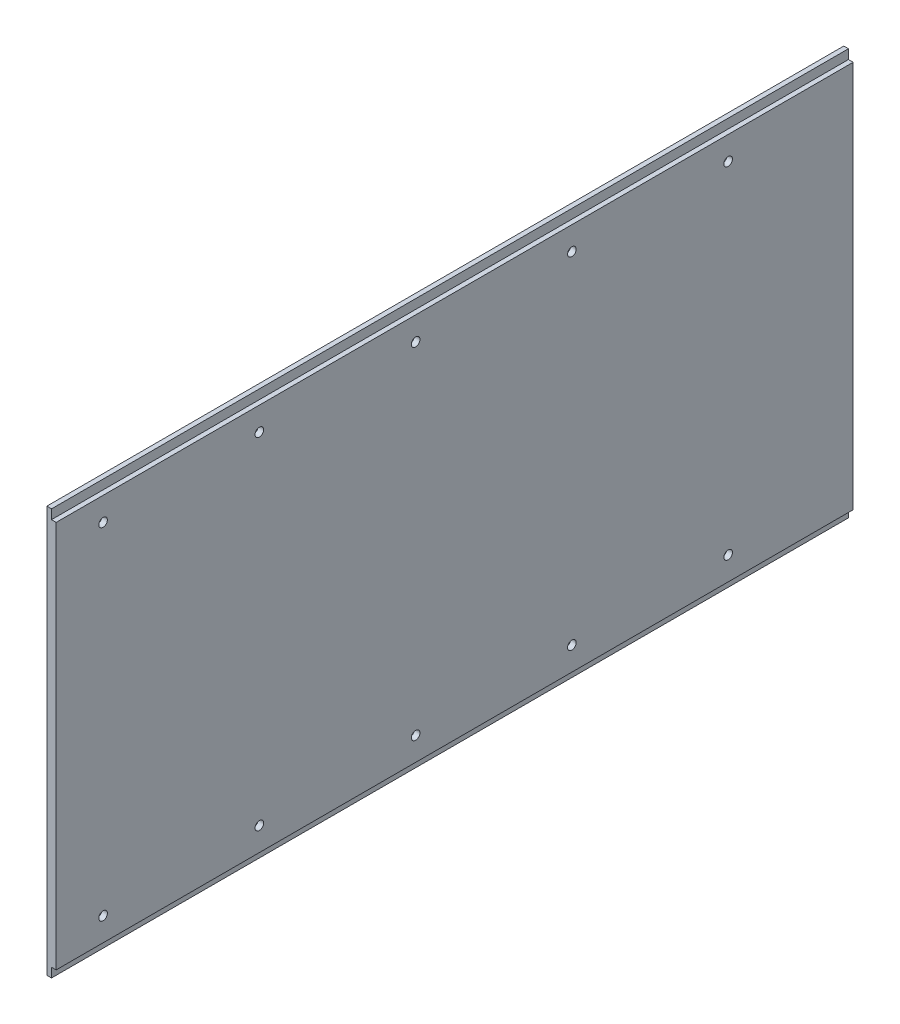
ISO-10303-21;
HEADER;
FILE_DESCRIPTION(('STEP AP214'),'2;1');
FILE_NAME('part.step','',(''),(''),'','','');
FILE_SCHEMA(('AUTOMOTIVE_DESIGN { 1 0 10303 214 1 1 1 1 }'));
ENDSEC;
DATA;
#1=APPLICATION_CONTEXT('core data for automotive mechanical design processes');
#2=APPLICATION_PROTOCOL_DEFINITION('international standard','automotive_design',2000,#1);
#3=PRODUCT_CONTEXT('',#1,'mechanical');
#4=PRODUCT('Part','Part','',(#3));
#5=PRODUCT_RELATED_PRODUCT_CATEGORY('part','',(#4));
#6=PRODUCT_DEFINITION_FORMATION('','',#4);
#7=PRODUCT_DEFINITION_CONTEXT('part definition',#1,'design');
#8=PRODUCT_DEFINITION('design','',#6,#7);
#9=PRODUCT_DEFINITION_SHAPE('','',#8);
#10=(LENGTH_UNIT() NAMED_UNIT(*) SI_UNIT(.MILLI.,.METRE.));
#11=(NAMED_UNIT(*) PLANE_ANGLE_UNIT() SI_UNIT($,.RADIAN.));
#12=(NAMED_UNIT(*) SI_UNIT($,.STERADIAN.) SOLID_ANGLE_UNIT());
#13=UNCERTAINTY_MEASURE_WITH_UNIT(LENGTH_MEASURE(1.E-05),#10,'distance_accuracy_value','');
#14=(GEOMETRIC_REPRESENTATION_CONTEXT(3) GLOBAL_UNCERTAINTY_ASSIGNED_CONTEXT((#13)) GLOBAL_UNIT_ASSIGNED_CONTEXT((#10,
#11,#12)) REPRESENTATION_CONTEXT('',''));
#15=CARTESIAN_POINT('',(0.,0.,0.));
#16=DIRECTION('',(0.,0.,1.));
#17=DIRECTION('',(1.,0.,0.));
#18=AXIS2_PLACEMENT_3D('',#15,#16,#17);
#19=CARTESIAN_POINT('',(6.,-130.,255.));
#20=DIRECTION('',(0.,0.,-1.));
#21=DIRECTION('',(-1.,0.,0.));
#22=AXIS2_PLACEMENT_3D('',#19,#20,#21);
#23=PLANE('',#22);
#24=DIRECTION('',(0.,-1.,0.));
#25=VECTOR('',#24,1.);
#26=CARTESIAN_POINT('',(6.,-130.,255.));
#27=LINE('',#26,#25);
#28=CARTESIAN_POINT('',(6.,124.,255.));
#29=VERTEX_POINT('',#28);
#30=CARTESIAN_POINT('',(6.,-124.,255.));
#31=VERTEX_POINT('',#30);
#32=EDGE_CURVE('E480',#29,#31,#27,.T.);
#33=ORIENTED_EDGE('',*,*,#32,.F.);
#34=DIRECTION('',(1.,0.,0.));
#35=VECTOR('',#34,1.);
#36=CARTESIAN_POINT('',(5.99999999999997,124.,255.));
#37=LINE('',#36,#35);
#38=CARTESIAN_POINT('',(2.99999999999997,124.,255.));
#39=VERTEX_POINT('',#38);
#40=EDGE_CURVE('E49',#39,#29,#37,.T.);
#41=ORIENTED_EDGE('',*,*,#40,.F.);
#42=DIRECTION('',(0.,-1.,0.));
#43=VECTOR('',#42,1.);
#44=CARTESIAN_POINT('',(2.99999999999997,130.,255.));
#45=LINE('',#44,#43);
#46=CARTESIAN_POINT('',(2.99999999999997,130.,255.));
#47=VERTEX_POINT('',#46);
#48=EDGE_CURVE('E493',#47,#39,#45,.T.);
#49=ORIENTED_EDGE('',*,*,#48,.F.);
#50=DIRECTION('',(-1.,0.,0.));
#51=VECTOR('',#50,1.);
#52=CARTESIAN_POINT('',(6.,130.,255.));
#53=LINE('',#52,#51);
#54=CARTESIAN_POINT('',(0.,130.,255.));
#55=VERTEX_POINT('',#54);
#56=EDGE_CURVE('E118',#47,#55,#53,.T.);
#57=ORIENTED_EDGE('',*,*,#56,.T.);
#58=DIRECTION('',(0.,-1.,0.));
#59=VECTOR('',#58,1.);
#60=CARTESIAN_POINT('',(0.,-130.,255.));
#61=LINE('',#60,#59);
#62=CARTESIAN_POINT('',(0.,-130.,255.));
#63=VERTEX_POINT('',#62);
#64=EDGE_CURVE('E477',#55,#63,#61,.T.);
#65=ORIENTED_EDGE('',*,*,#64,.T.);
#66=DIRECTION('',(-1.,0.,0.));
#67=VECTOR('',#66,1.);
#68=CARTESIAN_POINT('',(6.,-130.,255.));
#69=LINE('',#68,#67);
#70=CARTESIAN_POINT('',(3.,-130.,255.));
#71=VERTEX_POINT('',#70);
#72=EDGE_CURVE('E126',#71,#63,#69,.T.);
#73=ORIENTED_EDGE('',*,*,#72,.F.);
#74=DIRECTION('',(0.,-1.,0.));
#75=VECTOR('',#74,1.);
#76=CARTESIAN_POINT('',(3.,-130.,255.));
#77=LINE('',#76,#75);
#78=CARTESIAN_POINT('',(3.,-124.,255.));
#79=VERTEX_POINT('',#78);
#80=EDGE_CURVE('E464',#79,#71,#77,.T.);
#81=ORIENTED_EDGE('',*,*,#80,.F.);
#82=DIRECTION('',(-1.,0.,0.));
#83=VECTOR('',#82,1.);
#84=CARTESIAN_POINT('',(6.,-124.,255.));
#85=LINE('',#84,#83);
#86=EDGE_CURVE('E459',#31,#79,#85,.T.);
#87=ORIENTED_EDGE('',*,*,#86,.F.);
#88=EDGE_LOOP('',(#33,#41,#49,#57,#65,#73,#81,#87));
#89=FACE_BOUND('',#88,.T.);
#90=ADVANCED_FACE('F34',(#89),#23,.F.);
#91=CARTESIAN_POINT('',(6.,-130.,-255.));
#92=DIRECTION('',(0.,1.,0.));
#93=DIRECTION('',(0.,0.,1.));
#94=AXIS2_PLACEMENT_3D('',#91,#92,#93);
#95=PLANE('',#94);
#96=DIRECTION('',(-1.,0.,0.));
#97=VECTOR('',#96,1.);
#98=CARTESIAN_POINT('',(6.,-130.,-255.));
#99=LINE('',#98,#97);
#100=CARTESIAN_POINT('',(3.,-130.,-255.));
#101=VERTEX_POINT('',#100);
#102=CARTESIAN_POINT('',(0.,-130.,-255.));
#103=VERTEX_POINT('',#102);
#104=EDGE_CURVE('E124',#101,#103,#99,.T.);
#105=ORIENTED_EDGE('',*,*,#104,.F.);
#106=DIRECTION('',(0.,0.,1.));
#107=VECTOR('',#106,1.);
#108=CARTESIAN_POINT('',(3.,-130.,-255.));
#109=LINE('',#108,#107);
#110=EDGE_CURVE('E475',#101,#71,#109,.T.);
#111=ORIENTED_EDGE('',*,*,#110,.T.);
#112=ORIENTED_EDGE('',*,*,#72,.T.);
#113=DIRECTION('',(0.,0.,-1.));
#114=VECTOR('',#113,1.);
#115=CARTESIAN_POINT('',(0.,-130.,-255.));
#116=LINE('',#115,#114);
#117=EDGE_CURVE('E486',#63,#103,#116,.T.);
#118=ORIENTED_EDGE('',*,*,#117,.T.);
#119=EDGE_LOOP('',(#105,#111,#112,#118));
#120=FACE_BOUND('',#119,.T.);
#121=ADVANCED_FACE('F187',(#120),#95,.F.);
#122=CARTESIAN_POINT('',(6.,130.,-255.));
#123=DIRECTION('',(0.,0.,1.));
#124=DIRECTION('',(1.,0.,0.));
#125=AXIS2_PLACEMENT_3D('',#122,#123,#124);
#126=PLANE('',#125);
#127=DIRECTION('',(0.,-1.,0.));
#128=VECTOR('',#127,1.);
#129=CARTESIAN_POINT('',(2.99999999999997,130.,-255.));
#130=LINE('',#129,#128);
#131=CARTESIAN_POINT('',(2.99999999999997,130.,-255.));
#132=VERTEX_POINT('',#131);
#133=CARTESIAN_POINT('',(2.99999999999997,124.,-255.));
#134=VERTEX_POINT('',#133);
#135=EDGE_CURVE('E99',#132,#134,#130,.T.);
#136=ORIENTED_EDGE('',*,*,#135,.T.);
#137=DIRECTION('',(1.,0.,0.));
#138=VECTOR('',#137,1.);
#139=CARTESIAN_POINT('',(5.99999999999997,124.,-255.));
#140=LINE('',#139,#138);
#141=CARTESIAN_POINT('',(5.99999999999997,124.,-255.));
#142=VERTEX_POINT('',#141);
#143=EDGE_CURVE('E110',#134,#142,#140,.T.);
#144=ORIENTED_EDGE('',*,*,#143,.T.);
#145=DIRECTION('',(0.,1.,0.));
#146=VECTOR('',#145,1.);
#147=CARTESIAN_POINT('',(6.,130.,-255.));
#148=LINE('',#147,#146);
#149=CARTESIAN_POINT('',(6.,-124.,-255.));
#150=VERTEX_POINT('',#149);
#151=EDGE_CURVE('E128',#150,#142,#148,.T.);
#152=ORIENTED_EDGE('',*,*,#151,.F.);
#153=DIRECTION('',(-1.,0.,0.));
#154=VECTOR('',#153,1.);
#155=CARTESIAN_POINT('',(6.,-124.,-255.));
#156=LINE('',#155,#154);
#157=CARTESIAN_POINT('',(3.,-124.,-255.));
#158=VERTEX_POINT('',#157);
#159=EDGE_CURVE('E57',#150,#158,#156,.T.);
#160=ORIENTED_EDGE('',*,*,#159,.T.);
#161=DIRECTION('',(0.,-1.,0.));
#162=VECTOR('',#161,1.);
#163=CARTESIAN_POINT('',(3.,-130.,-255.));
#164=LINE('',#163,#162);
#165=EDGE_CURVE('E471',#158,#101,#164,.T.);
#166=ORIENTED_EDGE('',*,*,#165,.T.);
#167=ORIENTED_EDGE('',*,*,#104,.T.);
#168=DIRECTION('',(0.,1.,0.));
#169=VECTOR('',#168,1.);
#170=CARTESIAN_POINT('',(0.,130.,-255.));
#171=LINE('',#170,#169);
#172=CARTESIAN_POINT('',(0.,130.,-255.));
#173=VERTEX_POINT('',#172);
#174=EDGE_CURVE('E122',#103,#173,#171,.T.);
#175=ORIENTED_EDGE('',*,*,#174,.T.);
#176=DIRECTION('',(-1.,0.,0.));
#177=VECTOR('',#176,1.);
#178=CARTESIAN_POINT('',(6.,130.,-255.));
#179=LINE('',#178,#177);
#180=EDGE_CURVE('E116',#132,#173,#179,.T.);
#181=ORIENTED_EDGE('',*,*,#180,.F.);
#182=EDGE_LOOP('',(#136,#144,#152,#160,#166,#167,#175,#181));
#183=FACE_BOUND('',#182,.T.);
#184=ADVANCED_FACE('F120',(#183),#126,.F.);
#185=CARTESIAN_POINT('',(6.,130.,255.));
#186=DIRECTION('',(0.,-1.,0.));
#187=DIRECTION('',(0.,0.,-1.));
#188=AXIS2_PLACEMENT_3D('',#185,#186,#187);
#189=PLANE('',#188);
#190=ORIENTED_EDGE('',*,*,#56,.F.);
#191=DIRECTION('',(0.,0.,1.));
#192=VECTOR('',#191,1.);
#193=CARTESIAN_POINT('',(2.99999999999997,130.,-255.));
#194=LINE('',#193,#192);
#195=EDGE_CURVE('E103',#132,#47,#194,.T.);
#196=ORIENTED_EDGE('',*,*,#195,.F.);
#197=ORIENTED_EDGE('',*,*,#180,.T.);
#198=DIRECTION('',(0.,0.,1.));
#199=VECTOR('',#198,1.);
#200=CARTESIAN_POINT('',(0.,130.,255.));
#201=LINE('',#200,#199);
#202=EDGE_CURVE('E482',#173,#55,#201,.T.);
#203=ORIENTED_EDGE('',*,*,#202,.T.);
#204=EDGE_LOOP('',(#190,#196,#197,#203));
#205=FACE_BOUND('',#204,.T.);
#206=ADVANCED_FACE('F114',(#205),#189,.F.);
#207=CARTESIAN_POINT('',(6.,0.,0.));
#208=DIRECTION('',(-1.,0.,0.));
#209=DIRECTION('',(0.,0.,1.));
#210=AXIS2_PLACEMENT_3D('',#207,#208,#209);
#211=PLANE('',#210);
#212=CARTESIAN_POINT('',(6.,109.,-175.));
#213=DIRECTION('',(-1.,0.,0.));
#214=DIRECTION('',(0.,0.,1.));
#215=AXIS2_PLACEMENT_3D('',#212,#213,#214);
#216=CIRCLE('',#215,2.75);
#217=CARTESIAN_POINT('',(6.,109.,-172.25));
#218=VERTEX_POINT('',#217);
#219=EDGE_CURVE('E566',#218,#218,#216,.T.);
#220=ORIENTED_EDGE('',*,*,#219,.T.);
#221=EDGE_LOOP('',(#220));
#222=FACE_BOUND('',#221,.T.);
#223=CARTESIAN_POINT('',(6.,109.,-75.));
#224=DIRECTION('',(-1.,0.,0.));
#225=DIRECTION('',(0.,0.,1.));
#226=AXIS2_PLACEMENT_3D('',#223,#224,#225);
#227=CIRCLE('',#226,2.75);
#228=CARTESIAN_POINT('',(6.,109.,-72.25));
#229=VERTEX_POINT('',#228);
#230=EDGE_CURVE('E557',#229,#229,#227,.T.);
#231=ORIENTED_EDGE('',*,*,#230,.T.);
#232=EDGE_LOOP('',(#231));
#233=FACE_BOUND('',#232,.T.);
#234=CARTESIAN_POINT('',(6.,109.,25.));
#235=DIRECTION('',(-1.,0.,0.));
#236=DIRECTION('',(0.,0.,1.));
#237=AXIS2_PLACEMENT_3D('',#234,#235,#236);
#238=CIRCLE('',#237,2.75);
#239=CARTESIAN_POINT('',(6.,109.,27.75));
#240=VERTEX_POINT('',#239);
#241=EDGE_CURVE('E548',#240,#240,#238,.T.);
#242=ORIENTED_EDGE('',*,*,#241,.T.);
#243=EDGE_LOOP('',(#242));
#244=FACE_BOUND('',#243,.T.);
#245=CARTESIAN_POINT('',(6.,109.,125.));
#246=DIRECTION('',(-1.,0.,0.));
#247=DIRECTION('',(0.,0.,1.));
#248=AXIS2_PLACEMENT_3D('',#245,#246,#247);
#249=CIRCLE('',#248,2.75);
#250=CARTESIAN_POINT('',(6.,109.,127.75));
#251=VERTEX_POINT('',#250);
#252=EDGE_CURVE('E539',#251,#251,#249,.T.);
#253=ORIENTED_EDGE('',*,*,#252,.T.);
#254=EDGE_LOOP('',(#253));
#255=FACE_BOUND('',#254,.T.);
#256=CARTESIAN_POINT('',(6.,109.,225.));
#257=DIRECTION('',(-1.,0.,0.));
#258=DIRECTION('',(0.,0.,1.));
#259=AXIS2_PLACEMENT_3D('',#256,#257,#258);
#260=CIRCLE('',#259,2.75);
#261=CARTESIAN_POINT('',(6.,109.,227.75));
#262=VERTEX_POINT('',#261);
#263=EDGE_CURVE('E530',#262,#262,#260,.T.);
#264=ORIENTED_EDGE('',*,*,#263,.T.);
#265=EDGE_LOOP('',(#264));
#266=FACE_BOUND('',#265,.T.);
#267=CARTESIAN_POINT('',(6.,-109.,125.));
#268=DIRECTION('',(-1.,0.,0.));
#269=DIRECTION('',(0.,0.,1.));
#270=AXIS2_PLACEMENT_3D('',#267,#268,#269);
#271=CIRCLE('',#270,2.75);
#272=CARTESIAN_POINT('',(6.,-109.,127.75));
#273=VERTEX_POINT('',#272);
#274=EDGE_CURVE('E524',#273,#273,#271,.T.);
#275=ORIENTED_EDGE('',*,*,#274,.T.);
#276=EDGE_LOOP('',(#275));
#277=FACE_BOUND('',#276,.T.);
#278=CARTESIAN_POINT('',(6.,-109.,225.));
#279=DIRECTION('',(-1.,0.,0.));
#280=DIRECTION('',(0.,0.,1.));
#281=AXIS2_PLACEMENT_3D('',#278,#279,#280);
#282=CIRCLE('',#281,2.75);
#283=CARTESIAN_POINT('',(6.,-109.,227.75));
#284=VERTEX_POINT('',#283);
#285=EDGE_CURVE('E494',#284,#284,#282,.T.);
#286=ORIENTED_EDGE('',*,*,#285,.T.);
#287=EDGE_LOOP('',(#286));
#288=FACE_BOUND('',#287,.T.);
#289=ORIENTED_EDGE('',*,*,#151,.T.);
#290=DIRECTION('',(0.,0.,1.));
#291=VECTOR('',#290,1.);
#292=CARTESIAN_POINT('',(5.99999999999997,124.,-255.));
#293=LINE('',#292,#291);
#294=EDGE_CURVE('E465',#142,#29,#293,.T.);
#295=ORIENTED_EDGE('',*,*,#294,.T.);
#296=ORIENTED_EDGE('',*,*,#32,.T.);
#297=DIRECTION('',(0.,0.,1.));
#298=VECTOR('',#297,1.);
#299=CARTESIAN_POINT('',(6.,-124.,-255.));
#300=LINE('',#299,#298);
#301=EDGE_CURVE('E463',#150,#31,#300,.T.);
#302=ORIENTED_EDGE('',*,*,#301,.F.);
#303=EDGE_LOOP('',(#289,#295,#296,#302));
#304=FACE_BOUND('',#303,.T.);
#305=CARTESIAN_POINT('',(6.,-109.,25.));
#306=DIRECTION('',(-1.,0.,0.));
#307=DIRECTION('',(0.,0.,1.));
#308=AXIS2_PLACEMENT_3D('',#305,#306,#307);
#309=CIRCLE('',#308,2.75);
#310=CARTESIAN_POINT('',(6.,-109.,27.75));
#311=VERTEX_POINT('',#310);
#312=EDGE_CURVE('E136',#311,#311,#309,.T.);
#313=ORIENTED_EDGE('',*,*,#312,.T.);
#314=EDGE_LOOP('',(#313));
#315=FACE_BOUND('',#314,.T.);
#316=CARTESIAN_POINT('',(6.,-109.,-75.));
#317=DIRECTION('',(-1.,0.,0.));
#318=DIRECTION('',(0.,0.,1.));
#319=AXIS2_PLACEMENT_3D('',#316,#317,#318);
#320=CIRCLE('',#319,2.75);
#321=CARTESIAN_POINT('',(6.,-109.,-72.25));
#322=VERTEX_POINT('',#321);
#323=EDGE_CURVE('E145',#322,#322,#320,.T.);
#324=ORIENTED_EDGE('',*,*,#323,.T.);
#325=EDGE_LOOP('',(#324));
#326=FACE_BOUND('',#325,.T.);
#327=CARTESIAN_POINT('',(6.,-109.,-175.));
#328=DIRECTION('',(-1.,0.,0.));
#329=DIRECTION('',(0.,0.,1.));
#330=AXIS2_PLACEMENT_3D('',#327,#328,#329);
#331=CIRCLE('',#330,2.75);
#332=CARTESIAN_POINT('',(6.,-109.,-172.25));
#333=VERTEX_POINT('',#332);
#334=EDGE_CURVE('E42',#333,#333,#331,.T.);
#335=ORIENTED_EDGE('',*,*,#334,.T.);
#336=EDGE_LOOP('',(#335));
#337=FACE_BOUND('',#336,.T.);
#338=ADVANCED_FACE('F156',(#222,#233,#244,#255,#266,#277,#288,#304,#315,#326,#337),#211,.F.);
#339=CARTESIAN_POINT('',(0.,0.,0.));
#340=DIRECTION('',(-1.,0.,0.));
#341=DIRECTION('',(0.,0.,1.));
#342=AXIS2_PLACEMENT_3D('',#339,#340,#341);
#343=PLANE('',#342);
#344=CARTESIAN_POINT('',(0.,109.,-175.));
#345=DIRECTION('',(-1.,0.,0.));
#346=DIRECTION('',(0.,0.,1.));
#347=AXIS2_PLACEMENT_3D('',#344,#345,#346);
#348=CIRCLE('',#347,5.2);
#349=CARTESIAN_POINT('',(0.,109.,-169.8));
#350=VERTEX_POINT('',#349);
#351=EDGE_CURVE('E572',#350,#350,#348,.T.);
#352=ORIENTED_EDGE('',*,*,#351,.F.);
#353=EDGE_LOOP('',(#352));
#354=FACE_BOUND('',#353,.T.);
#355=CARTESIAN_POINT('',(0.,109.,-75.));
#356=DIRECTION('',(-1.,0.,0.));
#357=DIRECTION('',(0.,0.,1.));
#358=AXIS2_PLACEMENT_3D('',#355,#356,#357);
#359=CIRCLE('',#358,5.2);
#360=CARTESIAN_POINT('',(0.,109.,-69.8));
#361=VERTEX_POINT('',#360);
#362=EDGE_CURVE('E563',#361,#361,#359,.T.);
#363=ORIENTED_EDGE('',*,*,#362,.F.);
#364=EDGE_LOOP('',(#363));
#365=FACE_BOUND('',#364,.T.);
#366=CARTESIAN_POINT('',(0.,109.,25.));
#367=DIRECTION('',(-1.,0.,0.));
#368=DIRECTION('',(0.,0.,1.));
#369=AXIS2_PLACEMENT_3D('',#366,#367,#368);
#370=CIRCLE('',#369,5.2);
#371=CARTESIAN_POINT('',(0.,109.,30.2));
#372=VERTEX_POINT('',#371);
#373=EDGE_CURVE('E554',#372,#372,#370,.T.);
#374=ORIENTED_EDGE('',*,*,#373,.F.);
#375=EDGE_LOOP('',(#374));
#376=FACE_BOUND('',#375,.T.);
#377=CARTESIAN_POINT('',(0.,109.,125.));
#378=DIRECTION('',(-1.,0.,0.));
#379=DIRECTION('',(0.,0.,1.));
#380=AXIS2_PLACEMENT_3D('',#377,#378,#379);
#381=CIRCLE('',#380,5.2);
#382=CARTESIAN_POINT('',(0.,109.,130.2));
#383=VERTEX_POINT('',#382);
#384=EDGE_CURVE('E545',#383,#383,#381,.T.);
#385=ORIENTED_EDGE('',*,*,#384,.F.);
#386=EDGE_LOOP('',(#385));
#387=FACE_BOUND('',#386,.T.);
#388=CARTESIAN_POINT('',(0.,109.,225.));
#389=DIRECTION('',(-1.,0.,0.));
#390=DIRECTION('',(0.,0.,1.));
#391=AXIS2_PLACEMENT_3D('',#388,#389,#390);
#392=CIRCLE('',#391,5.2);
#393=CARTESIAN_POINT('',(0.,109.,230.2));
#394=VERTEX_POINT('',#393);
#395=EDGE_CURVE('E536',#394,#394,#392,.T.);
#396=ORIENTED_EDGE('',*,*,#395,.F.);
#397=EDGE_LOOP('',(#396));
#398=FACE_BOUND('',#397,.T.);
#399=CARTESIAN_POINT('',(0.,-109.,125.));
#400=DIRECTION('',(-1.,0.,0.));
#401=DIRECTION('',(0.,0.,1.));
#402=AXIS2_PLACEMENT_3D('',#399,#400,#401);
#403=CIRCLE('',#402,5.2);
#404=CARTESIAN_POINT('',(0.,-109.,130.2));
#405=VERTEX_POINT('',#404);
#406=EDGE_CURVE('E527',#405,#405,#403,.T.);
#407=ORIENTED_EDGE('',*,*,#406,.F.);
#408=EDGE_LOOP('',(#407));
#409=FACE_BOUND('',#408,.T.);
#410=CARTESIAN_POINT('',(0.,-109.,225.));
#411=DIRECTION('',(-1.,0.,0.));
#412=DIRECTION('',(0.,0.,1.));
#413=AXIS2_PLACEMENT_3D('',#410,#411,#412);
#414=CIRCLE('',#413,5.2);
#415=CARTESIAN_POINT('',(0.,-109.,230.2));
#416=VERTEX_POINT('',#415);
#417=EDGE_CURVE('E518',#416,#416,#414,.T.);
#418=ORIENTED_EDGE('',*,*,#417,.F.);
#419=EDGE_LOOP('',(#418));
#420=FACE_BOUND('',#419,.T.);
#421=ORIENTED_EDGE('',*,*,#64,.F.);
#422=ORIENTED_EDGE('',*,*,#202,.F.);
#423=ORIENTED_EDGE('',*,*,#174,.F.);
#424=ORIENTED_EDGE('',*,*,#117,.F.);
#425=EDGE_LOOP('',(#421,#422,#423,#424));
#426=FACE_BOUND('',#425,.T.);
#427=CARTESIAN_POINT('',(0.,-109.,25.));
#428=DIRECTION('',(-1.,0.,0.));
#429=DIRECTION('',(0.,0.,1.));
#430=AXIS2_PLACEMENT_3D('',#427,#428,#429);
#431=CIRCLE('',#430,5.2);
#432=CARTESIAN_POINT('',(0.,-109.,30.2));
#433=VERTEX_POINT('',#432);
#434=EDGE_CURVE('E133',#433,#433,#431,.T.);
#435=ORIENTED_EDGE('',*,*,#434,.F.);
#436=EDGE_LOOP('',(#435));
#437=FACE_BOUND('',#436,.T.);
#438=CARTESIAN_POINT('',(0.,-109.,-75.));
#439=DIRECTION('',(-1.,0.,0.));
#440=DIRECTION('',(0.,0.,1.));
#441=AXIS2_PLACEMENT_3D('',#438,#439,#440);
#442=CIRCLE('',#441,5.2);
#443=CARTESIAN_POINT('',(0.,-109.,-69.8));
#444=VERTEX_POINT('',#443);
#445=EDGE_CURVE('E142',#444,#444,#442,.T.);
#446=ORIENTED_EDGE('',*,*,#445,.F.);
#447=EDGE_LOOP('',(#446));
#448=FACE_BOUND('',#447,.T.);
#449=CARTESIAN_POINT('',(0.,-109.,-175.));
#450=DIRECTION('',(-1.,0.,0.));
#451=DIRECTION('',(0.,0.,1.));
#452=AXIS2_PLACEMENT_3D('',#449,#450,#451);
#453=CIRCLE('',#452,5.2);
#454=CARTESIAN_POINT('',(0.,-109.,-169.8));
#455=VERTEX_POINT('',#454);
#456=EDGE_CURVE('E151',#455,#455,#453,.T.);
#457=ORIENTED_EDGE('',*,*,#456,.F.);
#458=EDGE_LOOP('',(#457));
#459=FACE_BOUND('',#458,.T.);
#460=ADVANCED_FACE('F169',(#354,#365,#376,#387,#398,#409,#420,#426,#437,#448,#459),#343,.T.);
#461=CARTESIAN_POINT('',(3.,-130.,-255.));
#462=DIRECTION('',(-1.,0.,0.));
#463=DIRECTION('',(0.,0.,1.));
#464=AXIS2_PLACEMENT_3D('',#461,#462,#463);
#465=PLANE('',#464);
#466=ORIENTED_EDGE('',*,*,#80,.T.);
#467=ORIENTED_EDGE('',*,*,#110,.F.);
#468=ORIENTED_EDGE('',*,*,#165,.F.);
#469=DIRECTION('',(0.,0.,1.));
#470=VECTOR('',#469,1.);
#471=CARTESIAN_POINT('',(3.,-124.,-255.));
#472=LINE('',#471,#470);
#473=EDGE_CURVE('E461',#158,#79,#472,.T.);
#474=ORIENTED_EDGE('',*,*,#473,.T.);
#475=EDGE_LOOP('',(#466,#467,#468,#474));
#476=FACE_BOUND('',#475,.T.);
#477=ADVANCED_FACE('F171',(#476),#465,.F.);
#478=CARTESIAN_POINT('',(6.,-124.,-255.));
#479=DIRECTION('',(0.,1.,0.));
#480=DIRECTION('',(0.,0.,1.));
#481=AXIS2_PLACEMENT_3D('',#478,#479,#480);
#482=PLANE('',#481);
#483=ORIENTED_EDGE('',*,*,#86,.T.);
#484=ORIENTED_EDGE('',*,*,#473,.F.);
#485=ORIENTED_EDGE('',*,*,#159,.F.);
#486=ORIENTED_EDGE('',*,*,#301,.T.);
#487=EDGE_LOOP('',(#483,#484,#485,#486));
#488=FACE_BOUND('',#487,.T.);
#489=ADVANCED_FACE('F178',(#488),#482,.F.);
#490=CARTESIAN_POINT('',(5.99999999999997,124.,-255.));
#491=DIRECTION('',(0.,-1.,0.));
#492=DIRECTION('',(0.,0.,-1.));
#493=AXIS2_PLACEMENT_3D('',#490,#491,#492);
#494=PLANE('',#493);
#495=ORIENTED_EDGE('',*,*,#40,.T.);
#496=ORIENTED_EDGE('',*,*,#294,.F.);
#497=ORIENTED_EDGE('',*,*,#143,.F.);
#498=DIRECTION('',(0.,0.,1.));
#499=VECTOR('',#498,1.);
#500=CARTESIAN_POINT('',(2.99999999999997,124.,-255.));
#501=LINE('',#500,#499);
#502=EDGE_CURVE('E105',#134,#39,#501,.T.);
#503=ORIENTED_EDGE('',*,*,#502,.T.);
#504=EDGE_LOOP('',(#495,#496,#497,#503));
#505=FACE_BOUND('',#504,.T.);
#506=ADVANCED_FACE('F394',(#505),#494,.F.);
#507=CARTESIAN_POINT('',(2.99999999999997,130.,-255.));
#508=DIRECTION('',(-1.,0.,0.));
#509=DIRECTION('',(0.,0.,1.));
#510=AXIS2_PLACEMENT_3D('',#507,#508,#509);
#511=PLANE('',#510);
#512=ORIENTED_EDGE('',*,*,#48,.T.);
#513=ORIENTED_EDGE('',*,*,#502,.F.);
#514=ORIENTED_EDGE('',*,*,#135,.F.);
#515=ORIENTED_EDGE('',*,*,#195,.T.);
#516=EDGE_LOOP('',(#512,#513,#514,#515));
#517=FACE_BOUND('',#516,.T.);
#518=ADVANCED_FACE('F102',(#517),#511,.F.);
#519=CARTESIAN_POINT('',(0.,-109.,225.));
#520=DIRECTION('',(-1.,0.,0.));
#521=DIRECTION('',(0.,0.,1.));
#522=AXIS2_PLACEMENT_3D('',#519,#520,#521);
#523=CYLINDRICAL_SURFACE('',#522,2.75);
#524=ORIENTED_EDGE('',*,*,#285,.F.);
#525=EDGE_LOOP('',(#524));
#526=FACE_BOUND('',#525,.T.);
#527=CARTESIAN_POINT('',(2.45000000000001,-109.,225.));
#528=DIRECTION('',(-1.,0.,0.));
#529=DIRECTION('',(0.,0.,1.));
#530=AXIS2_PLACEMENT_3D('',#527,#528,#529);
#531=CIRCLE('',#530,2.74999999999999);
#532=CARTESIAN_POINT('',(2.45000000000001,-109.,227.75));
#533=VERTEX_POINT('',#532);
#534=EDGE_CURVE('E498',#533,#533,#531,.T.);
#535=ORIENTED_EDGE('',*,*,#534,.T.);
#536=EDGE_LOOP('',(#535));
#537=FACE_BOUND('',#536,.T.);
#538=ADVANCED_FACE('F377',(#526,#537),#523,.F.);
#539=CARTESIAN_POINT('',(0.,-109.,225.));
#540=DIRECTION('',(-1.,0.,0.));
#541=DIRECTION('',(0.,0.,1.));
#542=AXIS2_PLACEMENT_3D('',#539,#540,#541);
#543=CONICAL_SURFACE('',#542,5.2,0.785398163397448);
#544=ORIENTED_EDGE('',*,*,#534,.F.);
#545=EDGE_LOOP('',(#544));
#546=FACE_BOUND('',#545,.T.);
#547=ORIENTED_EDGE('',*,*,#417,.T.);
#548=EDGE_LOOP('',(#547));
#549=FACE_BOUND('',#548,.T.);
#550=ADVANCED_FACE('F368',(#546,#549),#543,.F.);
#551=CARTESIAN_POINT('',(0.,-109.,125.));
#552=DIRECTION('',(-1.,0.,0.));
#553=DIRECTION('',(0.,0.,1.));
#554=AXIS2_PLACEMENT_3D('',#551,#552,#553);
#555=CYLINDRICAL_SURFACE('',#554,2.75);
#556=ORIENTED_EDGE('',*,*,#274,.F.);
#557=EDGE_LOOP('',(#556));
#558=FACE_BOUND('',#557,.T.);
#559=CARTESIAN_POINT('',(2.45000000000001,-109.,125.));
#560=DIRECTION('',(-1.,0.,0.));
#561=DIRECTION('',(0.,0.,1.));
#562=AXIS2_PLACEMENT_3D('',#559,#560,#561);
#563=CIRCLE('',#562,2.74999999999999);
#564=CARTESIAN_POINT('',(2.45000000000001,-109.,127.75));
#565=VERTEX_POINT('',#564);
#566=EDGE_CURVE('E521',#565,#565,#563,.T.);
#567=ORIENTED_EDGE('',*,*,#566,.T.);
#568=EDGE_LOOP('',(#567));
#569=FACE_BOUND('',#568,.T.);
#570=ADVANCED_FACE('F359',(#558,#569),#555,.F.);
#571=CARTESIAN_POINT('',(0.,-109.,125.));
#572=DIRECTION('',(-1.,0.,0.));
#573=DIRECTION('',(0.,0.,1.));
#574=AXIS2_PLACEMENT_3D('',#571,#572,#573);
#575=CONICAL_SURFACE('',#574,5.2,0.785398163397448);
#576=ORIENTED_EDGE('',*,*,#566,.F.);
#577=EDGE_LOOP('',(#576));
#578=FACE_BOUND('',#577,.T.);
#579=ORIENTED_EDGE('',*,*,#406,.T.);
#580=EDGE_LOOP('',(#579));
#581=FACE_BOUND('',#580,.T.);
#582=ADVANCED_FACE('F206',(#578,#581),#575,.F.);
#583=CARTESIAN_POINT('',(0.,-109.,25.));
#584=DIRECTION('',(-1.,0.,0.));
#585=DIRECTION('',(0.,0.,1.));
#586=AXIS2_PLACEMENT_3D('',#583,#584,#585);
#587=CONICAL_SURFACE('',#586,5.2,0.785398163397448);
#588=CARTESIAN_POINT('',(2.45000000000001,-109.,25.));
#589=DIRECTION('',(-1.,0.,0.));
#590=DIRECTION('',(0.,0.,1.));
#591=AXIS2_PLACEMENT_3D('',#588,#589,#590);
#592=CIRCLE('',#591,2.74999999999999);
#593=CARTESIAN_POINT('',(2.45000000000001,-109.,27.75));
#594=VERTEX_POINT('',#593);
#595=EDGE_CURVE('E139',#594,#594,#592,.T.);
#596=ORIENTED_EDGE('',*,*,#595,.F.);
#597=EDGE_LOOP('',(#596));
#598=FACE_BOUND('',#597,.T.);
#599=ORIENTED_EDGE('',*,*,#434,.T.);
#600=EDGE_LOOP('',(#599));
#601=FACE_BOUND('',#600,.T.);
#602=ADVANCED_FACE('F202',(#598,#601),#587,.F.);
#603=CARTESIAN_POINT('',(0.,-109.,25.));
#604=DIRECTION('',(-1.,0.,0.));
#605=DIRECTION('',(0.,0.,1.));
#606=AXIS2_PLACEMENT_3D('',#603,#604,#605);
#607=CYLINDRICAL_SURFACE('',#606,2.75);
#608=ORIENTED_EDGE('',*,*,#312,.F.);
#609=EDGE_LOOP('',(#608));
#610=FACE_BOUND('',#609,.T.);
#611=ORIENTED_EDGE('',*,*,#595,.T.);
#612=EDGE_LOOP('',(#611));
#613=FACE_BOUND('',#612,.T.);
#614=ADVANCED_FACE('F198',(#610,#613),#607,.F.);
#615=CARTESIAN_POINT('',(0.,-109.,-75.));
#616=DIRECTION('',(-1.,0.,0.));
#617=DIRECTION('',(0.,0.,1.));
#618=AXIS2_PLACEMENT_3D('',#615,#616,#617);
#619=CONICAL_SURFACE('',#618,5.2,0.785398163397448);
#620=CARTESIAN_POINT('',(2.45000000000001,-109.,-75.));
#621=DIRECTION('',(-1.,0.,0.));
#622=DIRECTION('',(0.,0.,1.));
#623=AXIS2_PLACEMENT_3D('',#620,#621,#622);
#624=CIRCLE('',#623,2.74999999999999);
#625=CARTESIAN_POINT('',(2.45000000000001,-109.,-72.2500000000001));
#626=VERTEX_POINT('',#625);
#627=EDGE_CURVE('E148',#626,#626,#624,.T.);
#628=ORIENTED_EDGE('',*,*,#627,.F.);
#629=EDGE_LOOP('',(#628));
#630=FACE_BOUND('',#629,.T.);
#631=ORIENTED_EDGE('',*,*,#445,.T.);
#632=EDGE_LOOP('',(#631));
#633=FACE_BOUND('',#632,.T.);
#634=ADVANCED_FACE('F201',(#630,#633),#619,.F.);
#635=CARTESIAN_POINT('',(0.,-109.,-75.));
#636=DIRECTION('',(-1.,0.,0.));
#637=DIRECTION('',(0.,0.,1.));
#638=AXIS2_PLACEMENT_3D('',#635,#636,#637);
#639=CYLINDRICAL_SURFACE('',#638,2.75);
#640=ORIENTED_EDGE('',*,*,#323,.F.);
#641=EDGE_LOOP('',(#640));
#642=FACE_BOUND('',#641,.T.);
#643=ORIENTED_EDGE('',*,*,#627,.T.);
#644=EDGE_LOOP('',(#643));
#645=FACE_BOUND('',#644,.T.);
#646=ADVANCED_FACE('F166',(#642,#645),#639,.F.);
#647=CARTESIAN_POINT('',(0.,-109.,-175.));
#648=DIRECTION('',(-1.,0.,0.));
#649=DIRECTION('',(0.,0.,1.));
#650=AXIS2_PLACEMENT_3D('',#647,#648,#649);
#651=CONICAL_SURFACE('',#650,5.2,0.785398163397448);
#652=CARTESIAN_POINT('',(2.45000000000001,-109.,-175.));
#653=DIRECTION('',(-1.,0.,0.));
#654=DIRECTION('',(0.,0.,1.));
#655=AXIS2_PLACEMENT_3D('',#652,#653,#654);
#656=CIRCLE('',#655,2.74999999999999);
#657=CARTESIAN_POINT('',(2.45000000000001,-109.,-172.25));
#658=VERTEX_POINT('',#657);
#659=EDGE_CURVE('E11',#658,#658,#656,.T.);
#660=ORIENTED_EDGE('',*,*,#659,.F.);
#661=EDGE_LOOP('',(#660));
#662=FACE_BOUND('',#661,.T.);
#663=ORIENTED_EDGE('',*,*,#456,.T.);
#664=EDGE_LOOP('',(#663));
#665=FACE_BOUND('',#664,.T.);
#666=ADVANCED_FACE('F36',(#662,#665),#651,.F.);
#667=CARTESIAN_POINT('',(0.,-109.,-175.));
#668=DIRECTION('',(-1.,0.,0.));
#669=DIRECTION('',(0.,0.,1.));
#670=AXIS2_PLACEMENT_3D('',#667,#668,#669);
#671=CYLINDRICAL_SURFACE('',#670,2.75);
#672=ORIENTED_EDGE('',*,*,#334,.F.);
#673=EDGE_LOOP('',(#672));
#674=FACE_BOUND('',#673,.T.);
#675=ORIENTED_EDGE('',*,*,#659,.T.);
#676=EDGE_LOOP('',(#675));
#677=FACE_BOUND('',#676,.T.);
#678=ADVANCED_FACE('F158',(#674,#677),#671,.F.);
#679=CARTESIAN_POINT('',(0.,109.,225.));
#680=DIRECTION('',(-1.,0.,0.));
#681=DIRECTION('',(0.,0.,1.));
#682=AXIS2_PLACEMENT_3D('',#679,#680,#681);
#683=CYLINDRICAL_SURFACE('',#682,2.75);
#684=ORIENTED_EDGE('',*,*,#263,.F.);
#685=EDGE_LOOP('',(#684));
#686=FACE_BOUND('',#685,.T.);
#687=CARTESIAN_POINT('',(2.45000000000001,109.,225.));
#688=DIRECTION('',(-1.,0.,0.));
#689=DIRECTION('',(0.,0.,1.));
#690=AXIS2_PLACEMENT_3D('',#687,#688,#689);
#691=CIRCLE('',#690,2.74999999999999);
#692=CARTESIAN_POINT('',(2.45000000000001,109.,227.75));
#693=VERTEX_POINT('',#692);
#694=EDGE_CURVE('E533',#693,#693,#691,.T.);
#695=ORIENTED_EDGE('',*,*,#694,.T.);
#696=EDGE_LOOP('',(#695));
#697=FACE_BOUND('',#696,.T.);
#698=ADVANCED_FACE('F161',(#686,#697),#683,.F.);
#699=CARTESIAN_POINT('',(0.,109.,225.));
#700=DIRECTION('',(-1.,0.,0.));
#701=DIRECTION('',(0.,0.,1.));
#702=AXIS2_PLACEMENT_3D('',#699,#700,#701);
#703=CONICAL_SURFACE('',#702,5.2,0.785398163397448);
#704=ORIENTED_EDGE('',*,*,#694,.F.);
#705=EDGE_LOOP('',(#704));
#706=FACE_BOUND('',#705,.T.);
#707=ORIENTED_EDGE('',*,*,#395,.T.);
#708=EDGE_LOOP('',(#707));
#709=FACE_BOUND('',#708,.T.);
#710=ADVANCED_FACE('F241',(#706,#709),#703,.F.);
#711=CARTESIAN_POINT('',(0.,109.,125.));
#712=DIRECTION('',(-1.,0.,0.));
#713=DIRECTION('',(0.,0.,1.));
#714=AXIS2_PLACEMENT_3D('',#711,#712,#713);
#715=CYLINDRICAL_SURFACE('',#714,2.75);
#716=ORIENTED_EDGE('',*,*,#252,.F.);
#717=EDGE_LOOP('',(#716));
#718=FACE_BOUND('',#717,.T.);
#719=CARTESIAN_POINT('',(2.45000000000001,109.,125.));
#720=DIRECTION('',(-1.,0.,0.));
#721=DIRECTION('',(0.,0.,1.));
#722=AXIS2_PLACEMENT_3D('',#719,#720,#721);
#723=CIRCLE('',#722,2.74999999999999);
#724=CARTESIAN_POINT('',(2.45000000000001,109.,127.75));
#725=VERTEX_POINT('',#724);
#726=EDGE_CURVE('E542',#725,#725,#723,.T.);
#727=ORIENTED_EDGE('',*,*,#726,.T.);
#728=EDGE_LOOP('',(#727));
#729=FACE_BOUND('',#728,.T.);
#730=ADVANCED_FACE('F249',(#718,#729),#715,.F.);
#731=CARTESIAN_POINT('',(0.,109.,125.));
#732=DIRECTION('',(-1.,0.,0.));
#733=DIRECTION('',(0.,0.,1.));
#734=AXIS2_PLACEMENT_3D('',#731,#732,#733);
#735=CONICAL_SURFACE('',#734,5.2,0.785398163397448);
#736=ORIENTED_EDGE('',*,*,#726,.F.);
#737=EDGE_LOOP('',(#736));
#738=FACE_BOUND('',#737,.T.);
#739=ORIENTED_EDGE('',*,*,#384,.T.);
#740=EDGE_LOOP('',(#739));
#741=FACE_BOUND('',#740,.T.);
#742=ADVANCED_FACE('F257',(#738,#741),#735,.F.);
#743=CARTESIAN_POINT('',(0.,109.,25.));
#744=DIRECTION('',(-1.,0.,0.));
#745=DIRECTION('',(0.,0.,1.));
#746=AXIS2_PLACEMENT_3D('',#743,#744,#745);
#747=CYLINDRICAL_SURFACE('',#746,2.75);
#748=ORIENTED_EDGE('',*,*,#241,.F.);
#749=EDGE_LOOP('',(#748));
#750=FACE_BOUND('',#749,.T.);
#751=CARTESIAN_POINT('',(2.45000000000001,109.,25.));
#752=DIRECTION('',(-1.,0.,0.));
#753=DIRECTION('',(0.,0.,1.));
#754=AXIS2_PLACEMENT_3D('',#751,#752,#753);
#755=CIRCLE('',#754,2.74999999999999);
#756=CARTESIAN_POINT('',(2.45000000000001,109.,27.75));
#757=VERTEX_POINT('',#756);
#758=EDGE_CURVE('E551',#757,#757,#755,.T.);
#759=ORIENTED_EDGE('',*,*,#758,.T.);
#760=EDGE_LOOP('',(#759));
#761=FACE_BOUND('',#760,.T.);
#762=ADVANCED_FACE('F265',(#750,#761),#747,.F.);
#763=CARTESIAN_POINT('',(0.,109.,25.));
#764=DIRECTION('',(-1.,0.,0.));
#765=DIRECTION('',(0.,0.,1.));
#766=AXIS2_PLACEMENT_3D('',#763,#764,#765);
#767=CONICAL_SURFACE('',#766,5.2,0.785398163397448);
#768=ORIENTED_EDGE('',*,*,#758,.F.);
#769=EDGE_LOOP('',(#768));
#770=FACE_BOUND('',#769,.T.);
#771=ORIENTED_EDGE('',*,*,#373,.T.);
#772=EDGE_LOOP('',(#771));
#773=FACE_BOUND('',#772,.T.);
#774=ADVANCED_FACE('F273',(#770,#773),#767,.F.);
#775=CARTESIAN_POINT('',(0.,109.,-75.));
#776=DIRECTION('',(-1.,0.,0.));
#777=DIRECTION('',(0.,0.,1.));
#778=AXIS2_PLACEMENT_3D('',#775,#776,#777);
#779=CYLINDRICAL_SURFACE('',#778,2.75);
#780=ORIENTED_EDGE('',*,*,#230,.F.);
#781=EDGE_LOOP('',(#780));
#782=FACE_BOUND('',#781,.T.);
#783=CARTESIAN_POINT('',(2.45000000000001,109.,-75.));
#784=DIRECTION('',(-1.,0.,0.));
#785=DIRECTION('',(0.,0.,1.));
#786=AXIS2_PLACEMENT_3D('',#783,#784,#785);
#787=CIRCLE('',#786,2.74999999999999);
#788=CARTESIAN_POINT('',(2.45000000000001,109.,-72.2500000000001));
#789=VERTEX_POINT('',#788);
#790=EDGE_CURVE('E560',#789,#789,#787,.T.);
#791=ORIENTED_EDGE('',*,*,#790,.T.);
#792=EDGE_LOOP('',(#791));
#793=FACE_BOUND('',#792,.T.);
#794=ADVANCED_FACE('F281',(#782,#793),#779,.F.);
#795=CARTESIAN_POINT('',(0.,109.,-75.));
#796=DIRECTION('',(-1.,0.,0.));
#797=DIRECTION('',(0.,0.,1.));
#798=AXIS2_PLACEMENT_3D('',#795,#796,#797);
#799=CONICAL_SURFACE('',#798,5.2,0.785398163397448);
#800=ORIENTED_EDGE('',*,*,#790,.F.);
#801=EDGE_LOOP('',(#800));
#802=FACE_BOUND('',#801,.T.);
#803=ORIENTED_EDGE('',*,*,#362,.T.);
#804=EDGE_LOOP('',(#803));
#805=FACE_BOUND('',#804,.T.);
#806=ADVANCED_FACE('F289',(#802,#805),#799,.F.);
#807=CARTESIAN_POINT('',(0.,109.,-175.));
#808=DIRECTION('',(-1.,0.,0.));
#809=DIRECTION('',(0.,0.,1.));
#810=AXIS2_PLACEMENT_3D('',#807,#808,#809);
#811=CYLINDRICAL_SURFACE('',#810,2.75);
#812=ORIENTED_EDGE('',*,*,#219,.F.);
#813=EDGE_LOOP('',(#812));
#814=FACE_BOUND('',#813,.T.);
#815=CARTESIAN_POINT('',(2.45000000000001,109.,-175.));
#816=DIRECTION('',(-1.,0.,0.));
#817=DIRECTION('',(0.,0.,1.));
#818=AXIS2_PLACEMENT_3D('',#815,#816,#817);
#819=CIRCLE('',#818,2.74999999999999);
#820=CARTESIAN_POINT('',(2.45000000000001,109.,-172.25));
#821=VERTEX_POINT('',#820);
#822=EDGE_CURVE('E569',#821,#821,#819,.T.);
#823=ORIENTED_EDGE('',*,*,#822,.T.);
#824=EDGE_LOOP('',(#823));
#825=FACE_BOUND('',#824,.T.);
#826=ADVANCED_FACE('F297',(#814,#825),#811,.F.);
#827=CARTESIAN_POINT('',(0.,109.,-175.));
#828=DIRECTION('',(-1.,0.,0.));
#829=DIRECTION('',(0.,0.,1.));
#830=AXIS2_PLACEMENT_3D('',#827,#828,#829);
#831=CONICAL_SURFACE('',#830,5.2,0.785398163397448);
#832=ORIENTED_EDGE('',*,*,#822,.F.);
#833=EDGE_LOOP('',(#832));
#834=FACE_BOUND('',#833,.T.);
#835=ORIENTED_EDGE('',*,*,#351,.T.);
#836=EDGE_LOOP('',(#835));
#837=FACE_BOUND('',#836,.T.);
#838=ADVANCED_FACE('F305',(#834,#837),#831,.F.);
#839=CLOSED_SHELL('',(#90,#121,#184,#206,#338,#460,#477,#489,#506,#518,#538,#550,#570,#582,#602,
#614,#634,#646,#666,#678,#698,#710,#730,#742,#762,#774,#794,#806,#826,#838));
#840=MANIFOLD_SOLID_BREP('B2',#839);
#841=ADVANCED_BREP_SHAPE_REPRESENTATION('',(#18,#840),#14);
#842=SHAPE_DEFINITION_REPRESENTATION(#9,#841);
ENDSEC;
END-ISO-10303-21;
